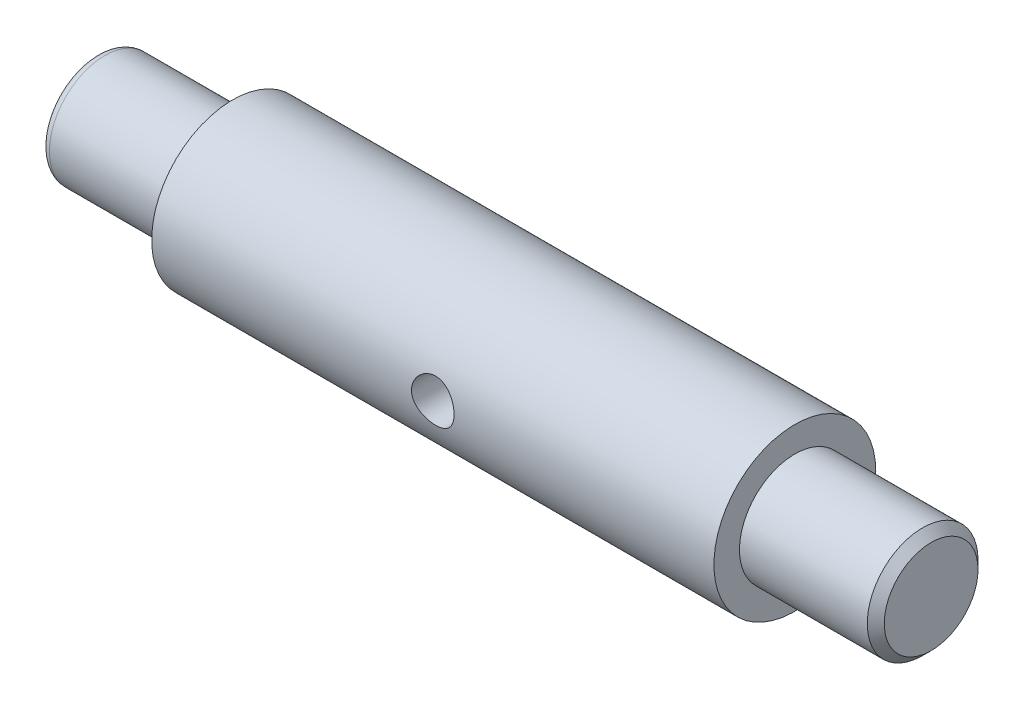
ISO-10303-21;
HEADER;
FILE_DESCRIPTION(('STEP AP214'),'2;1');
FILE_NAME('part.step','',(''),(''),'','','');
FILE_SCHEMA(('AUTOMOTIVE_DESIGN { 1 0 10303 214 1 1 1 1 }'));
ENDSEC;
DATA;
#1=APPLICATION_CONTEXT('core data for automotive mechanical design processes');
#2=APPLICATION_PROTOCOL_DEFINITION('international standard','automotive_design',2000,#1);
#3=PRODUCT_CONTEXT('',#1,'mechanical');
#4=PRODUCT('Part','Part','',(#3));
#5=PRODUCT_RELATED_PRODUCT_CATEGORY('part','',(#4));
#6=PRODUCT_DEFINITION_FORMATION('','',#4);
#7=PRODUCT_DEFINITION_CONTEXT('part definition',#1,'design');
#8=PRODUCT_DEFINITION('design','',#6,#7);
#9=PRODUCT_DEFINITION_SHAPE('','',#8);
#10=(LENGTH_UNIT() NAMED_UNIT(*) SI_UNIT(.MILLI.,.METRE.));
#11=(NAMED_UNIT(*) PLANE_ANGLE_UNIT() SI_UNIT($,.RADIAN.));
#12=(NAMED_UNIT(*) SI_UNIT($,.STERADIAN.) SOLID_ANGLE_UNIT());
#13=UNCERTAINTY_MEASURE_WITH_UNIT(LENGTH_MEASURE(1.E-05),#10,'distance_accuracy_value','');
#14=(GEOMETRIC_REPRESENTATION_CONTEXT(3) GLOBAL_UNCERTAINTY_ASSIGNED_CONTEXT((#13)) GLOBAL_UNIT_ASSIGNED_CONTEXT((#10,
#11,#12)) REPRESENTATION_CONTEXT('',''));
#15=CARTESIAN_POINT('',(0.,0.,0.));
#16=DIRECTION('',(0.,0.,1.));
#17=DIRECTION('',(1.,0.,0.));
#18=AXIS2_PLACEMENT_3D('',#15,#16,#17);
#19=CARTESIAN_POINT('',(-33.,0.,-9.5));
#20=DIRECTION('',(-1.,0.,0.));
#21=DIRECTION('',(0.,0.,1.));
#22=AXIS2_PLACEMENT_3D('',#19,#20,#21);
#23=PLANE('',#22);
#24=CARTESIAN_POINT('',(-33.,0.,0.));
#25=DIRECTION('',(1.,0.,0.));
#26=DIRECTION('',(0.,0.,-1.));
#27=AXIS2_PLACEMENT_3D('',#24,#25,#26);
#28=CIRCLE('',#27,6.5);
#29=CARTESIAN_POINT('',(-33.,0.,-6.5));
#30=VERTEX_POINT('',#29);
#31=EDGE_CURVE('E58',#30,#30,#28,.T.);
#32=ORIENTED_EDGE('',*,*,#31,.T.);
#33=EDGE_LOOP('',(#32));
#34=FACE_BOUND('',#33,.T.);
#35=CARTESIAN_POINT('',(-33.,0.,0.));
#36=DIRECTION('',(1.,0.,0.));
#37=DIRECTION('',(0.,0.,-1.));
#38=AXIS2_PLACEMENT_3D('',#35,#36,#37);
#39=CIRCLE('',#38,9.5);
#40=CARTESIAN_POINT('',(-33.,0.,-9.5));
#41=VERTEX_POINT('',#40);
#42=EDGE_CURVE('E125',#41,#41,#39,.T.);
#43=ORIENTED_EDGE('',*,*,#42,.F.);
#44=EDGE_LOOP('',(#43));
#45=FACE_BOUND('',#44,.T.);
#46=ADVANCED_FACE('F39',(#34,#45),#23,.T.);
#47=CARTESIAN_POINT('',(49.,0.,0.));
#48=DIRECTION('',(1.,0.,0.));
#49=DIRECTION('',(0.,0.,-1.));
#50=AXIS2_PLACEMENT_3D('',#47,#48,#49);
#51=CYLINDRICAL_SURFACE('',#50,6.5);
#52=CARTESIAN_POINT('',(-48.,0.,0.));
#53=DIRECTION('',(1.,0.,0.));
#54=DIRECTION('',(0.,0.,-1.));
#55=AXIS2_PLACEMENT_3D('',#52,#53,#54);
#56=CIRCLE('',#55,6.5);
#57=CARTESIAN_POINT('',(-48.,0.,-6.5));
#58=VERTEX_POINT('',#57);
#59=EDGE_CURVE('E146',#58,#58,#56,.T.);
#60=ORIENTED_EDGE('',*,*,#59,.T.);
#61=EDGE_LOOP('',(#60));
#62=FACE_BOUND('',#61,.T.);
#63=ORIENTED_EDGE('',*,*,#31,.F.);
#64=EDGE_LOOP('',(#63));
#65=FACE_BOUND('',#64,.T.);
#66=ADVANCED_FACE('F112',(#62,#65),#51,.T.);
#67=CARTESIAN_POINT('',(-48.,0.,0.));
#68=DIRECTION('',(1.,0.,0.));
#69=DIRECTION('',(0.,0.,-1.));
#70=AXIS2_PLACEMENT_3D('',#67,#68,#69);
#71=TOROIDAL_SURFACE('',#70,5.5,1.);
#72=CARTESIAN_POINT('',(-49.,0.,0.));
#73=DIRECTION('',(1.,0.,0.));
#74=DIRECTION('',(0.,0.,-1.));
#75=AXIS2_PLACEMENT_3D('',#72,#73,#74);
#76=CIRCLE('',#75,5.49999999999999);
#77=CARTESIAN_POINT('',(-49.,0.,-5.49999999999999));
#78=VERTEX_POINT('',#77);
#79=EDGE_CURVE('E143',#78,#78,#76,.T.);
#80=ORIENTED_EDGE('',*,*,#79,.T.);
#81=EDGE_LOOP('',(#80));
#82=FACE_BOUND('',#81,.T.);
#83=ORIENTED_EDGE('',*,*,#59,.F.);
#84=EDGE_LOOP('',(#83));
#85=FACE_BOUND('',#84,.T.);
#86=ADVANCED_FACE('F108',(#82,#85),#71,.T.);
#87=CARTESIAN_POINT('',(-49.,0.,-5.49999999999999));
#88=DIRECTION('',(-1.,0.,0.));
#89=DIRECTION('',(0.,0.,1.));
#90=AXIS2_PLACEMENT_3D('',#87,#88,#89);
#91=PLANE('',#90);
#92=CARTESIAN_POINT('',(-49.,0.,0.));
#93=DIRECTION('',(1.,0.,0.));
#94=DIRECTION('',(0.,0.,-1.));
#95=AXIS2_PLACEMENT_3D('',#92,#93,#94);
#96=CIRCLE('',#95,3.625);
#97=CARTESIAN_POINT('',(-49.,0.,-3.625));
#98=VERTEX_POINT('',#97);
#99=EDGE_CURVE('E140',#98,#98,#96,.T.);
#100=ORIENTED_EDGE('',*,*,#99,.T.);
#101=EDGE_LOOP('',(#100));
#102=FACE_BOUND('',#101,.T.);
#103=ORIENTED_EDGE('',*,*,#79,.F.);
#104=EDGE_LOOP('',(#103));
#105=FACE_BOUND('',#104,.T.);
#106=ADVANCED_FACE('F104',(#102,#105),#91,.T.);
#107=CARTESIAN_POINT('',(-48.375,0.,0.));
#108=DIRECTION('',(1.,0.,0.));
#109=DIRECTION('',(0.,0.,-1.));
#110=AXIS2_PLACEMENT_3D('',#107,#108,#109);
#111=TOROIDAL_SURFACE('',#110,3.625,0.625);
#112=CARTESIAN_POINT('',(-48.375,0.,0.));
#113=DIRECTION('',(1.,0.,0.));
#114=DIRECTION('',(0.,0.,-1.));
#115=AXIS2_PLACEMENT_3D('',#112,#113,#114);
#116=CIRCLE('',#115,3.);
#117=CARTESIAN_POINT('',(-48.375,0.,-3.));
#118=VERTEX_POINT('',#117);
#119=EDGE_CURVE('E137',#118,#118,#116,.T.);
#120=ORIENTED_EDGE('',*,*,#119,.T.);
#121=EDGE_LOOP('',(#120));
#122=FACE_BOUND('',#121,.T.);
#123=ORIENTED_EDGE('',*,*,#99,.F.);
#124=EDGE_LOOP('',(#123));
#125=FACE_BOUND('',#124,.T.);
#126=ADVANCED_FACE('F98',(#122,#125),#111,.T.);
#127=CARTESIAN_POINT('',(49.,0.,0.));
#128=DIRECTION('',(1.,0.,0.));
#129=DIRECTION('',(0.,0.,-1.));
#130=AXIS2_PLACEMENT_3D('',#127,#128,#129);
#131=CYLINDRICAL_SURFACE('',#130,3.);
#132=CARTESIAN_POINT('',(-2.5,0.,-3.));
#133=CARTESIAN_POINT('',(-2.49999511444632,-0.118757533193203,-2.99999522795205));
#134=CARTESIAN_POINT('',(-2.49147749609542,-0.237551281104128,-2.99288670594742));
#135=CARTESIAN_POINT('',(-2.45803727664817,-0.471182492492811,-2.96510762868268));
#136=CARTESIAN_POINT('',(-2.43310252602469,-0.586016959612417,-2.94442702942008));
#137=CARTESIAN_POINT('',(-2.36868788266729,-0.807829942407297,-2.89142690238865));
#138=CARTESIAN_POINT('',(-2.32929492564629,-0.914850920904901,-2.8591769655007));
#139=CARTESIAN_POINT('',(-2.23798295205742,-1.11984139043408,-2.78529176182903));
#140=CARTESIAN_POINT('',(-2.18605970332675,-1.21780780775233,-2.74365332434937));
#141=CARTESIAN_POINT('',(-2.05054625019185,-1.43789998519767,-2.63674191529867));
#142=CARTESIAN_POINT('',(-1.96232979581782,-1.5556821965722,-2.56840549256191));
#143=CARTESIAN_POINT('',(-1.76947567424863,-1.77202398328147,-2.42422624777674));
#144=CARTESIAN_POINT('',(-1.66479243075689,-1.87052845158605,-2.34836281453276));
#145=CARTESIAN_POINT('',(-1.49591572350891,-2.00437263805588,-2.23294886313738));
#146=CARTESIAN_POINT('',(-1.4370444238087,-2.04699726278816,-2.19383679994997));
#147=CARTESIAN_POINT('',(-1.3154943970395,-2.12715295529554,-2.11620611809194));
#148=CARTESIAN_POINT('',(-1.25281440512926,-2.16468231743739,-2.07768770195023));
#149=CARTESIAN_POINT('',(-1.12373267566439,-2.23441122570746,-2.00250543288661));
#150=CARTESIAN_POINT('',(-1.05734021527518,-2.26662332666226,-1.96583735754651));
#151=CARTESIAN_POINT('',(-0.92055371607161,-2.32553690612792,-1.89577686630311));
#152=CARTESIAN_POINT('',(-0.850163152658207,-2.3522430799868,-1.86238167220904));
#153=CARTESIAN_POINT('',(-0.698332909799902,-2.40193513934005,-1.79791918980412));
#154=CARTESIAN_POINT('',(-0.616475907276521,-2.42433807692598,-1.76736311251003));
#155=CARTESIAN_POINT('',(-0.4481102311869,-2.46101313675502,-1.71593180556004));
#156=CARTESIAN_POINT('',(-0.361613413385329,-2.47530499393792,-1.69503310194197));
#157=CARTESIAN_POINT('',(-0.184234591620548,-2.49481072799048,-1.66620928968844));
#158=CARTESIAN_POINT('',(-0.0933120409293111,-2.49991205058667,-1.65844510563093));
#159=CARTESIAN_POINT('',(0.088562613002758,-2.5000856937119,-1.65818308531825));
#160=CARTESIAN_POINT('',(0.179514716615331,-2.49515788278405,-1.6656854491694));
#161=CARTESIAN_POINT('',(0.365524710827116,-2.47505262029594,-1.69541639464497));
#162=CARTESIAN_POINT('',(0.46029374571706,-2.45905577113332,-1.71881932066467));
#163=CARTESIAN_POINT('',(0.644210981202169,-2.41742550503027,-1.77688235738914));
#164=CARTESIAN_POINT('',(0.733339370714817,-2.39176011044289,-1.81157977103025));
#165=CARTESIAN_POINT('',(0.887827078541098,-2.33816270346873,-1.88002226126137));
#166=CARTESIAN_POINT('',(0.954312242411647,-2.31177513033566,-1.91250316845439));
#167=CARTESIAN_POINT('',(1.08365080677993,-2.25404424958636,-1.98021996661529));
#168=CARTESIAN_POINT('',(1.14650204786583,-2.22269803586306,-2.01545746697785));
#169=CARTESIAN_POINT('',(1.32996684101967,-2.12149677560466,-2.12342648109725));
#170=CARTESIAN_POINT('',(1.44541414760608,-2.04450664231777,-2.19837696967438));
#171=CARTESIAN_POINT('',(1.66826696245435,-1.86765914501414,-2.35079897952278));
#172=CARTESIAN_POINT('',(1.77493832399189,-1.76681805277628,-2.42819792618944));
#173=CARTESIAN_POINT('',(1.9711123448174,-1.54484388336149,-2.57509054043285));
#174=CARTESIAN_POINT('',(2.06065203305626,-1.42375565615773,-2.64460112267364));
#175=CARTESIAN_POINT('',(2.19941483909855,-1.19411179169416,-2.75428914126547));
#176=CARTESIAN_POINT('',(2.25314289818765,-1.08972732107277,-2.79748350073995));
#177=CARTESIAN_POINT('',(2.34634274525534,-0.871071458330367,-2.87307804019801));
#178=CARTESIAN_POINT('',(2.38582343158057,-0.756806292780763,-2.90548495660805));
#179=CARTESIAN_POINT('',(2.4484172499322,-0.519954301215418,-2.95709834265565));
#180=CARTESIAN_POINT('',(2.47140394665756,-0.397310923125307,-2.97620280955844));
#181=CARTESIAN_POINT('',(2.49870923192719,-0.148559976923726,-2.99891434528972));
#182=CARTESIAN_POINT('',(2.50304031085016,-0.0224547835240011,-3.00253178304177));
#183=CARTESIAN_POINT('',(2.49333756055624,0.213310199456575,-2.99444999039147));
#184=CARTESIAN_POINT('',(2.48144136128483,0.323130540835859,-2.98453350716313));
#185=CARTESIAN_POINT('',(2.44373304978851,0.538644964400605,-2.95325589460135));
#186=CARTESIAN_POINT('',(2.41791926828104,0.644338549989562,-2.93189339242796));
#187=CARTESIAN_POINT('',(2.35337660454474,0.850565499199257,-2.87889521546186));
#188=CARTESIAN_POINT('',(2.31447921055573,0.951010682223317,-2.84712564891974));
#189=CARTESIAN_POINT('',(2.2256043676633,1.14365900898104,-2.77536124733889));
#190=CARTESIAN_POINT('',(2.17562282300671,1.2358590883121,-2.73536337221808));
#191=CARTESIAN_POINT('',(2.04156820465303,1.45067439735099,-2.62975152158594));
#192=CARTESIAN_POINT('',(1.9522674167327,1.56834359540731,-2.56070244234714));
#193=CARTESIAN_POINT('',(1.75715961734437,1.78428994740848,-2.41522445403191));
#194=CARTESIAN_POINT('',(1.65130154464525,1.88250490855173,-2.33877300422835));
#195=CARTESIAN_POINT('',(1.48058803207138,2.01573314784291,-2.222698055986));
#196=CARTESIAN_POINT('',(1.42110172702401,2.05811069143949,-2.1834115173603));
#197=CARTESIAN_POINT('',(1.29827918396772,2.13771669597406,-2.10553153817181));
#198=CARTESIAN_POINT('',(1.2349415723359,2.17494330406755,-2.06693835133607));
#199=CARTESIAN_POINT('',(1.10451159608481,2.24398857026757,-1.99176108482639));
#200=CARTESIAN_POINT('',(1.03742977546639,2.27582148781538,-1.95517188634212));
#201=CARTESIAN_POINT('',(0.899209895500169,2.3338885673946,-1.88547561448179));
#202=CARTESIAN_POINT('',(0.828075629580628,2.36012785984655,-1.8523653645079));
#203=CARTESIAN_POINT('',(0.675729631648113,2.40837357148322,-1.78925557416047));
#204=CARTESIAN_POINT('',(0.594165548926274,2.42988314318544,-1.75970711786653));
#205=CARTESIAN_POINT('',(0.426548046057394,2.46482255689514,-1.71043063887427));
#206=CARTESIAN_POINT('',(0.340506428672119,2.47827257713357,-1.69067811225259));
#207=CARTESIAN_POINT('',(0.164362392587668,2.49617289535263,-1.6641531597946));
#208=CARTESIAN_POINT('',(0.0742246702493123,2.5005179918396,-1.65753251048391));
#209=CARTESIAN_POINT('',(-0.105853212783939,2.49938197104455,-1.65924308630667));
#210=CARTESIAN_POINT('',(-0.195793315125139,2.49389826274012,-1.66757825402155));
#211=CARTESIAN_POINT('',(-0.381672575390523,2.4726526384854,-1.69892898735519));
#212=CARTESIAN_POINT('',(-0.47723027053268,2.45585812550761,-1.72341371023858));
#213=CARTESIAN_POINT('',(-0.662531296082708,2.41250339675091,-1.78358728037387));
#214=CARTESIAN_POINT('',(-0.752254228709298,2.38591088285909,-1.81931312531326));
#215=CARTESIAN_POINT('',(-0.907789041354843,2.33050835844919,-1.88952619366194));
#216=CARTESIAN_POINT('',(-0.974743759234924,2.30325853049531,-1.92277816627791));
#217=CARTESIAN_POINT('',(-1.1049463864244,2.24370627018012,-1.99195185230571));
#218=CARTESIAN_POINT('',(-1.16819211099982,2.21140090020864,-2.0278751115052));
#219=CARTESIAN_POINT('',(-1.35272956134196,2.10716294428985,-2.13775931167912));
#220=CARTESIAN_POINT('',(-1.46874692499193,2.02793576743751,-2.2137978016432));
#221=CARTESIAN_POINT('',(-1.69200726129125,1.84629697567414,-2.36772603763546));
#222=CARTESIAN_POINT('',(-1.79854179403293,1.7429395959328,-2.44552394429512));
#223=CARTESIAN_POINT('',(-1.99386379953934,1.51553554935621,-2.59256498427755));
#224=CARTESIAN_POINT('',(-2.08269056587395,1.39153583663215,-2.66182692543068));
#225=CARTESIAN_POINT('',(-2.21831419672309,1.15855518141083,-2.76942305781508));
#226=CARTESIAN_POINT('',(-2.27003851021944,1.05399877947693,-2.81112174006883));
#227=CARTESIAN_POINT('',(-2.35921867023858,0.835439786054357,-2.88361460666453));
#228=CARTESIAN_POINT('',(-2.39669352409529,0.721450026753903,-2.9144233132377));
#229=CARTESIAN_POINT('',(-2.45018845582659,0.506620038886857,-2.95858745904691));
#230=CARTESIAN_POINT('',(-2.46877512222678,0.406845468761923,-2.97402142398111));
#231=CARTESIAN_POINT('',(-2.49368236823808,0.204722725654237,-2.99472922794408));
#232=CARTESIAN_POINT('',(-2.50000421158692,0.102374818922784,-3.00000411373941));
#233=CARTESIAN_POINT('',(-2.5,0.,-3.));
#234=B_SPLINE_CURVE_WITH_KNOTS('',3,(#132,#133,#134,#135,#136,#137,#138,#139,#140,#141,#142,
#143,#144,#145,#146,#147,#148,#149,#150,#151,#152,#153,#154,#155,#156,#157,#158,#159,#160,#161,
#162,#163,#164,#165,#166,#167,#168,#169,#170,#171,#172,#173,#174,#175,#176,#177,#178,#179,#180,
#181,#182,#183,#184,#185,#186,#187,#188,#189,#190,#191,#192,#193,#194,#195,#196,#197,#198,#199,
#200,#201,#202,#203,#204,#205,#206,#207,#208,#209,#210,#211,#212,#213,#214,#215,#216,#217,#218,
#219,#220,#221,#222,#223,#224,#225,#226,#227,#228,#229,#230,#231,#232,#233),.UNSPECIFIED.,.T.,
.F.,(4,2,2,2,2,2,2,2,2,2,2,2,2,2,2,2,2,2,2,2,2,2,2,2,2,2,2,2,2,2,2,2,2,2,2,2,2,2,2,2,2,2,2,2,2,
2,2,2,2,2,4),(0.,0.355841276815113,0.711946191026961,1.06594405359551,1.42006164830116,
1.90425178760126,2.38980643116775,2.63722280423449,2.88472179650724,3.13162777943676,
3.37832232674674,3.64812890035755,3.91727616616869,4.18969776924975,4.46212294312047,
4.75723524199722,5.05333228584568,5.28870178855694,5.52420974868633,5.9954933935898,
6.49137310548271,6.98616858956867,7.36002155957576,7.73364063000476,8.11009395319721,
8.48629519274361,8.81743460677926,9.14861374669872,9.48423297747607,9.81997643164434,
10.3065635514456,10.7946819775667,11.0432812121088,11.2919696391639,11.5399899810636,
11.787781852862,12.0551105531685,12.3217671309317,12.5914881373799,12.8612802568452,
13.1598101383752,13.4593330283462,13.6977271411687,13.9362602949129,14.4135864576438,
14.914300110886,15.413889999571,15.7841228897598,16.1538601797496,16.4606444271243,
16.7673970625124),.UNSPECIFIED.);
#235=CARTESIAN_POINT('',(-2.5,0.,-3.));
#236=VERTEX_POINT('',#235);
#237=EDGE_CURVE('E87',#236,#236,#234,.T.);
#238=ORIENTED_EDGE('',*,*,#237,.F.);
#239=EDGE_LOOP('',(#238));
#240=FACE_BOUND('',#239,.T.);
#241=CARTESIAN_POINT('',(2.5,0.,3.));
#242=CARTESIAN_POINT('',(2.49999511444632,-0.118757533193203,2.99999522795205));
#243=CARTESIAN_POINT('',(2.49147749609542,-0.237551281104128,2.99288670594742));
#244=CARTESIAN_POINT('',(2.45803727664817,-0.471182492492811,2.96510762868268));
#245=CARTESIAN_POINT('',(2.43310252602469,-0.586016959612417,2.94442702942007));
#246=CARTESIAN_POINT('',(2.36868788266729,-0.807829942407297,2.89142690238865));
#247=CARTESIAN_POINT('',(2.32929492564629,-0.914850920904901,2.8591769655007));
#248=CARTESIAN_POINT('',(2.23798295205742,-1.11984139043408,2.78529176182902));
#249=CARTESIAN_POINT('',(2.18605970332675,-1.21780780775233,2.74365332434936));
#250=CARTESIAN_POINT('',(2.05054625019184,-1.43789998519767,2.63674191529867));
#251=CARTESIAN_POINT('',(1.96232979581782,-1.5556821965722,2.56840549256191));
#252=CARTESIAN_POINT('',(1.76947567424863,-1.77202398328147,2.42422624777674));
#253=CARTESIAN_POINT('',(1.66479243075689,-1.87052845158605,2.34836281453276));
#254=CARTESIAN_POINT('',(1.49591572350891,-2.00437263805588,2.23294886313738));
#255=CARTESIAN_POINT('',(1.4370444238087,-2.04699726278816,2.19383679994997));
#256=CARTESIAN_POINT('',(1.3154943970395,-2.12715295529554,2.11620611809193));
#257=CARTESIAN_POINT('',(1.25281440512926,-2.16468231743739,2.07768770195023));
#258=CARTESIAN_POINT('',(1.12373267566439,-2.23441122570746,2.00250543288661));
#259=CARTESIAN_POINT('',(1.05734021527518,-2.26662332666227,1.96583735754651));
#260=CARTESIAN_POINT('',(0.920553716071609,-2.32553690612792,1.89577686630311));
#261=CARTESIAN_POINT('',(0.850163152658207,-2.3522430799868,1.86238167220904));
#262=CARTESIAN_POINT('',(0.698332909799902,-2.40193513934005,1.79791918980412));
#263=CARTESIAN_POINT('',(0.61647590727652,-2.42433807692598,1.76736311251003));
#264=CARTESIAN_POINT('',(0.448110231186899,-2.46101313675502,1.71593180556003));
#265=CARTESIAN_POINT('',(0.361613413385328,-2.47530499393792,1.69503310194197));
#266=CARTESIAN_POINT('',(0.184234591620548,-2.49481072799048,1.66620928968844));
#267=CARTESIAN_POINT('',(0.0933120409293107,-2.49991205058667,1.65844510563093));
#268=CARTESIAN_POINT('',(-0.0885626130027583,-2.5000856937119,1.65818308531825));
#269=CARTESIAN_POINT('',(-0.179514716615332,-2.49515788278405,1.6656854491694));
#270=CARTESIAN_POINT('',(-0.365524710827117,-2.47505262029594,1.69541639464497));
#271=CARTESIAN_POINT('',(-0.46029374571706,-2.45905577113332,1.71881932066467));
#272=CARTESIAN_POINT('',(-0.64421098120217,-2.41742550503027,1.77688235738913));
#273=CARTESIAN_POINT('',(-0.733339370714817,-2.39176011044289,1.81157977103024));
#274=CARTESIAN_POINT('',(-0.887827078541099,-2.33816270346873,1.88002226126137));
#275=CARTESIAN_POINT('',(-0.954312242411648,-2.31177513033566,1.91250316845439));
#276=CARTESIAN_POINT('',(-1.08365080677993,-2.25404424958636,1.98021996661529));
#277=CARTESIAN_POINT('',(-1.14650204786584,-2.22269803586306,2.01545746697785));
#278=CARTESIAN_POINT('',(-1.32996684101967,-2.12149677560466,2.12342648109724));
#279=CARTESIAN_POINT('',(-1.44541414760608,-2.04450664231777,2.19837696967438));
#280=CARTESIAN_POINT('',(-1.66826696245435,-1.86765914501414,2.35079897952277));
#281=CARTESIAN_POINT('',(-1.77493832399189,-1.76681805277628,2.42819792618944));
#282=CARTESIAN_POINT('',(-1.9711123448174,-1.54484388336149,2.57509054043285));
#283=CARTESIAN_POINT('',(-2.06065203305626,-1.42375565615773,2.64460112267364));
#284=CARTESIAN_POINT('',(-2.19941483909855,-1.19411179169416,2.75428914126547));
#285=CARTESIAN_POINT('',(-2.25314289818765,-1.08972732107277,2.79748350073995));
#286=CARTESIAN_POINT('',(-2.34634274525534,-0.871071458330366,2.87307804019801));
#287=CARTESIAN_POINT('',(-2.38582343158057,-0.756806292780763,2.90548495660805));
#288=CARTESIAN_POINT('',(-2.4484172499322,-0.519954301215418,2.95709834265565));
#289=CARTESIAN_POINT('',(-2.47140394665756,-0.397310923125308,2.97620280955844));
#290=CARTESIAN_POINT('',(-2.49870923192719,-0.148559976923726,2.99891434528972));
#291=CARTESIAN_POINT('',(-2.50304031085016,-0.0224547835240012,3.00253178304177));
#292=CARTESIAN_POINT('',(-2.49333756055624,0.213310199456575,2.99444999039147));
#293=CARTESIAN_POINT('',(-2.48144136128483,0.323130540835859,2.98453350716313));
#294=CARTESIAN_POINT('',(-2.44373304978851,0.538644964400605,2.95325589460135));
#295=CARTESIAN_POINT('',(-2.41791926828104,0.644338549989562,2.93189339242796));
#296=CARTESIAN_POINT('',(-2.35337660454474,0.850565499199257,2.87889521546186));
#297=CARTESIAN_POINT('',(-2.31447921055573,0.951010682223317,2.84712564891974));
#298=CARTESIAN_POINT('',(-2.2256043676633,1.14365900898104,2.77536124733889));
#299=CARTESIAN_POINT('',(-2.17562282300671,1.2358590883121,2.73536337221808));
#300=CARTESIAN_POINT('',(-2.04156820465303,1.45067439735099,2.62975152158594));
#301=CARTESIAN_POINT('',(-1.9522674167327,1.56834359540731,2.56070244234714));
#302=CARTESIAN_POINT('',(-1.75715961734437,1.78428994740848,2.41522445403191));
#303=CARTESIAN_POINT('',(-1.65130154464525,1.88250490855173,2.33877300422835));
#304=CARTESIAN_POINT('',(-1.48058803207139,2.01573314784291,2.222698055986));
#305=CARTESIAN_POINT('',(-1.42110172702401,2.05811069143949,2.1834115173603));
#306=CARTESIAN_POINT('',(-1.29827918396772,2.13771669597406,2.10553153817181));
#307=CARTESIAN_POINT('',(-1.2349415723359,2.17494330406755,2.06693835133607));
#308=CARTESIAN_POINT('',(-1.10451159608481,2.24398857026757,1.99176108482639));
#309=CARTESIAN_POINT('',(-1.03742977546639,2.27582148781538,1.95517188634212));
#310=CARTESIAN_POINT('',(-0.899209895500171,2.3338885673946,1.88547561448179));
#311=CARTESIAN_POINT('',(-0.82807562958063,2.36012785984655,1.8523653645079));
#312=CARTESIAN_POINT('',(-0.675729631648114,2.40837357148322,1.78925557416047));
#313=CARTESIAN_POINT('',(-0.594165548926275,2.42988314318544,1.75970711786653));
#314=CARTESIAN_POINT('',(-0.426548046057395,2.46482255689514,1.71043063887427));
#315=CARTESIAN_POINT('',(-0.34050642867212,2.47827257713357,1.69067811225259));
#316=CARTESIAN_POINT('',(-0.164362392587669,2.49617289535263,1.6641531597946));
#317=CARTESIAN_POINT('',(-0.0742246702493137,2.5005179918396,1.65753251048391));
#318=CARTESIAN_POINT('',(0.105853212783938,2.49938197104455,1.65924308630667));
#319=CARTESIAN_POINT('',(0.195793315125138,2.49389826274012,1.66757825402155));
#320=CARTESIAN_POINT('',(0.381672575390523,2.4726526384854,1.69892898735519));
#321=CARTESIAN_POINT('',(0.47723027053268,2.45585812550761,1.72341371023858));
#322=CARTESIAN_POINT('',(0.662531296082708,2.41250339675091,1.78358728037387));
#323=CARTESIAN_POINT('',(0.752254228709298,2.38591088285909,1.81931312531326));
#324=CARTESIAN_POINT('',(0.907789041354843,2.33050835844919,1.88952619366194));
#325=CARTESIAN_POINT('',(0.974743759234924,2.30325853049531,1.92277816627791));
#326=CARTESIAN_POINT('',(1.1049463864244,2.24370627018012,1.9919518523057));
#327=CARTESIAN_POINT('',(1.16819211099982,2.21140090020864,2.0278751115052));
#328=CARTESIAN_POINT('',(1.35272956134196,2.10716294428985,2.13775931167912));
#329=CARTESIAN_POINT('',(1.46874692499194,2.02793576743751,2.2137978016432));
#330=CARTESIAN_POINT('',(1.69200726129125,1.84629697567414,2.36772603763546));
#331=CARTESIAN_POINT('',(1.79854179403292,1.7429395959328,2.44552394429512));
#332=CARTESIAN_POINT('',(1.99386379953934,1.51553554935621,2.59256498427754));
#333=CARTESIAN_POINT('',(2.08269056587395,1.39153583663215,2.66182692543068));
#334=CARTESIAN_POINT('',(2.21831419672309,1.15855518141083,2.76942305781508));
#335=CARTESIAN_POINT('',(2.27003851021944,1.05399877947693,2.81112174006882));
#336=CARTESIAN_POINT('',(2.35921867023858,0.835439786054358,2.88361460666452));
#337=CARTESIAN_POINT('',(2.39669352409529,0.721450026753904,2.9144233132377));
#338=CARTESIAN_POINT('',(2.45018845582659,0.506620038886858,2.9585874590469));
#339=CARTESIAN_POINT('',(2.46877512222678,0.406845468761923,2.97402142398111));
#340=CARTESIAN_POINT('',(2.49368236823808,0.204722725654237,2.99472922794408));
#341=CARTESIAN_POINT('',(2.50000421158692,0.102374818922784,3.00000411373941));
#342=CARTESIAN_POINT('',(2.5,0.,3.));
#343=B_SPLINE_CURVE_WITH_KNOTS('',3,(#241,#242,#243,#244,#245,#246,#247,#248,#249,#250,#251,
#252,#253,#254,#255,#256,#257,#258,#259,#260,#261,#262,#263,#264,#265,#266,#267,#268,#269,#270,
#271,#272,#273,#274,#275,#276,#277,#278,#279,#280,#281,#282,#283,#284,#285,#286,#287,#288,#289,
#290,#291,#292,#293,#294,#295,#296,#297,#298,#299,#300,#301,#302,#303,#304,#305,#306,#307,#308,
#309,#310,#311,#312,#313,#314,#315,#316,#317,#318,#319,#320,#321,#322,#323,#324,#325,#326,#327,
#328,#329,#330,#331,#332,#333,#334,#335,#336,#337,#338,#339,#340,#341,#342),.UNSPECIFIED.,.T.,
.F.,(4,2,2,2,2,2,2,2,2,2,2,2,2,2,2,2,2,2,2,2,2,2,2,2,2,2,2,2,2,2,2,2,2,2,2,2,2,2,2,2,2,2,2,2,2,
2,2,2,2,2,4),(0.,0.355841276815113,0.711946191026961,1.06594405359551,1.42006164830116,
1.90425178760126,2.38980643116775,2.63722280423449,2.88472179650724,3.13162777943676,
3.37832232674674,3.64812890035755,3.91727616616869,4.18969776924975,4.46212294312047,
4.75723524199722,5.05333228584568,5.28870178855694,5.52420974868633,5.9954933935898,
6.49137310548271,6.98616858956867,7.36002155957576,7.73364063000476,8.11009395319721,
8.48629519274361,8.81743460677927,9.14861374669872,9.48423297747607,9.81997643164434,
10.3065635514456,10.7946819775667,11.0432812121088,11.2919696391639,11.5399899810636,
11.787781852862,12.0551105531685,12.3217671309317,12.5914881373799,12.8612802568452,
13.1598101383752,13.4593330283462,13.6977271411687,13.9362602949129,14.4135864576438,
14.914300110886,15.413889999571,15.7841228897598,16.1538601797496,16.4606444271243,
16.7673970625124),.UNSPECIFIED.);
#344=CARTESIAN_POINT('',(2.5,0.,3.));
#345=VERTEX_POINT('',#344);
#346=EDGE_CURVE('E81',#345,#345,#343,.T.);
#347=ORIENTED_EDGE('',*,*,#346,.F.);
#348=EDGE_LOOP('',(#347));
#349=FACE_BOUND('',#348,.T.);
#350=ORIENTED_EDGE('',*,*,#119,.F.);
#351=EDGE_LOOP('',(#350));
#352=FACE_BOUND('',#351,.T.);
#353=CARTESIAN_POINT('',(12.,0.,0.));
#354=DIRECTION('',(-1.,0.,0.));
#355=DIRECTION('',(0.,0.,1.));
#356=AXIS2_PLACEMENT_3D('',#353,#354,#355);
#357=CIRCLE('',#356,3.);
#358=CARTESIAN_POINT('',(12.,0.,3.));
#359=VERTEX_POINT('',#358);
#360=EDGE_CURVE('E128',#359,#359,#357,.T.);
#361=ORIENTED_EDGE('',*,*,#360,.F.);
#362=EDGE_LOOP('',(#361));
#363=FACE_BOUND('',#362,.T.);
#364=ADVANCED_FACE('F92',(#240,#349,#352,#363),#131,.F.);
#365=CARTESIAN_POINT('',(49.,0.,-6.5));
#366=DIRECTION('',(1.,0.,0.));
#367=DIRECTION('',(0.,0.,-1.));
#368=AXIS2_PLACEMENT_3D('',#365,#366,#367);
#369=PLANE('',#368);
#370=CARTESIAN_POINT('',(49.,0.,0.));
#371=DIRECTION('',(1.,0.,0.));
#372=DIRECTION('',(0.,0.,-1.));
#373=AXIS2_PLACEMENT_3D('',#370,#371,#372);
#374=CIRCLE('',#373,5.49999999999999);
#375=CARTESIAN_POINT('',(49.,0.,-5.49999999999999));
#376=VERTEX_POINT('',#375);
#377=EDGE_CURVE('E53',#376,#376,#374,.T.);
#378=ORIENTED_EDGE('',*,*,#377,.T.);
#379=EDGE_LOOP('',(#378));
#380=FACE_BOUND('',#379,.T.);
#381=ADVANCED_FACE('F97',(#380),#369,.T.);
#382=CARTESIAN_POINT('',(49.,0.,0.));
#383=DIRECTION('',(1.,0.,0.));
#384=DIRECTION('',(0.,0.,-1.));
#385=AXIS2_PLACEMENT_3D('',#382,#383,#384);
#386=CYLINDRICAL_SURFACE('',#385,6.49999999999999);
#387=CARTESIAN_POINT('',(48.,0.,0.));
#388=DIRECTION('',(1.,0.,0.));
#389=DIRECTION('',(0.,0.,-1.));
#390=AXIS2_PLACEMENT_3D('',#387,#388,#389);
#391=CIRCLE('',#390,6.49999999999999);
#392=CARTESIAN_POINT('',(48.,0.,-6.5));
#393=VERTEX_POINT('',#392);
#394=EDGE_CURVE('E10',#393,#393,#391,.F.);
#395=ORIENTED_EDGE('',*,*,#394,.T.);
#396=EDGE_LOOP('',(#395));
#397=FACE_BOUND('',#396,.T.);
#398=CARTESIAN_POINT('',(33.,0.,0.));
#399=DIRECTION('',(1.,0.,0.));
#400=DIRECTION('',(0.,0.,-1.));
#401=AXIS2_PLACEMENT_3D('',#398,#399,#400);
#402=CIRCLE('',#401,6.49999999999999);
#403=CARTESIAN_POINT('',(33.,0.,-6.49999999999999));
#404=VERTEX_POINT('',#403);
#405=EDGE_CURVE('E131',#404,#404,#402,.T.);
#406=ORIENTED_EDGE('',*,*,#405,.T.);
#407=EDGE_LOOP('',(#406));
#408=FACE_BOUND('',#407,.T.);
#409=ADVANCED_FACE('F175',(#397,#408),#386,.T.);
#410=CARTESIAN_POINT('',(33.,0.,-9.5));
#411=DIRECTION('',(1.,0.,0.));
#412=DIRECTION('',(0.,0.,-1.));
#413=AXIS2_PLACEMENT_3D('',#410,#411,#412);
#414=PLANE('',#413);
#415=CARTESIAN_POINT('',(33.,0.,0.));
#416=DIRECTION('',(1.,0.,0.));
#417=DIRECTION('',(0.,0.,-1.));
#418=AXIS2_PLACEMENT_3D('',#415,#416,#417);
#419=CIRCLE('',#418,9.5);
#420=CARTESIAN_POINT('',(33.,0.,-9.5));
#421=VERTEX_POINT('',#420);
#422=EDGE_CURVE('E127',#421,#421,#419,.T.);
#423=ORIENTED_EDGE('',*,*,#422,.T.);
#424=EDGE_LOOP('',(#423));
#425=FACE_BOUND('',#424,.T.);
#426=ORIENTED_EDGE('',*,*,#405,.F.);
#427=EDGE_LOOP('',(#426));
#428=FACE_BOUND('',#427,.T.);
#429=ADVANCED_FACE('F169',(#425,#428),#414,.T.);
#430=CARTESIAN_POINT('',(49.,0.,0.));
#431=DIRECTION('',(1.,0.,0.));
#432=DIRECTION('',(0.,0.,-1.));
#433=AXIS2_PLACEMENT_3D('',#430,#431,#432);
#434=CYLINDRICAL_SURFACE('',#433,9.5);
#435=CARTESIAN_POINT('',(-2.5,0.,-9.5));
#436=CARTESIAN_POINT('',(-2.49999659165872,0.137884663200167,-9.4999978589319));
#437=CARTESIAN_POINT('',(-2.48855441851344,0.275806169982054,-9.49696845553717));
#438=CARTESIAN_POINT('',(-2.44316636127436,0.547680422104071,-9.48517762614523));
#439=CARTESIAN_POINT('',(-2.40920923415978,0.681631149673865,-9.47641333641575));
#440=CARTESIAN_POINT('',(-2.31996842460177,0.941599795218326,-9.45412076326044));
#441=CARTESIAN_POINT('',(-2.26471183560934,1.06762755548515,-9.44059853395071));
#442=CARTESIAN_POINT('',(-2.13453997893622,1.30862652881559,-9.41022151532826));
#443=CARTESIAN_POINT('',(-2.05962353819611,1.42359708156079,-9.39336652717205));
#444=CARTESIAN_POINT('',(-1.89046838430234,1.64181993629425,-9.35771941636593));
#445=CARTESIAN_POINT('',(-1.79586767243448,1.74478634632153,-9.33889486727958));
#446=CARTESIAN_POINT('',(-1.59080344133392,1.93359084586557,-9.30164002957558));
#447=CARTESIAN_POINT('',(-1.48033793898573,2.01942679084604,-9.28320979057852));
#448=CARTESIAN_POINT('',(-1.24441123162361,2.17291708512181,-9.24849966110085));
#449=CARTESIAN_POINT('',(-1.11873074770614,2.24024449868173,-9.23226073792112));
#450=CARTESIAN_POINT('',(-0.857337895776609,2.35270147526438,-9.20424780640168));
#451=CARTESIAN_POINT('',(-0.721627328959783,2.39783501276008,-9.19247299871599));
#452=CARTESIAN_POINT('',(-0.447188071893532,2.46363395134783,-9.17505594709916));
#453=CARTESIAN_POINT('',(-0.308591852154177,2.48481677617339,-9.16928424369479));
#454=CARTESIAN_POINT('',(-0.029701994327015,2.50372582423423,-9.16413995150101));
#455=CARTESIAN_POINT('',(0.110591330921411,2.50145630672462,-9.16476620075867));
#456=CARTESIAN_POINT('',(0.384870229447289,2.47393631594875,-9.1722310773399));
#457=CARTESIAN_POINT('',(0.518923733737234,2.44930986906015,-9.1789010040012));
#458=CARTESIAN_POINT('',(0.780926003675862,2.37877367007175,-9.19743185586801));
#459=CARTESIAN_POINT('',(0.908874291939745,2.33286225663581,-9.2092931862694));
#460=CARTESIAN_POINT('',(1.15667078708533,2.22054589835919,-9.23702010881477));
#461=CARTESIAN_POINT('',(1.27641410406569,2.1539205316978,-9.25292841794965));
#462=CARTESIAN_POINT('',(1.50324135914492,2.00222137020021,-9.28693362281546));
#463=CARTESIAN_POINT('',(1.61032285819791,1.91714402987704,-9.30503093886097));
#464=CARTESIAN_POINT('',(1.81235449245534,1.72775627146103,-9.3420790135668));
#465=CARTESIAN_POINT('',(1.90681192197981,1.62292126601543,-9.36103863220119));
#466=CARTESIAN_POINT('',(2.07690465439776,1.3986680904507,-9.39715951587145));
#467=CARTESIAN_POINT('',(2.15253925337258,1.27924937519245,-9.41432071363776));
#468=CARTESIAN_POINT('',(2.28304842996164,1.02846858783735,-9.44501219877018));
#469=CARTESIAN_POINT('',(2.33783581683645,0.89705914371785,-9.45852716922197));
#470=CARTESIAN_POINT('',(2.42440041379598,0.626458525351713,-9.48029259145042));
#471=CARTESIAN_POINT('',(2.45618251631392,0.487269012444906,-9.48854416252685));
#472=CARTESIAN_POINT('',(2.4950653206345,0.209265832527546,-9.49868456798611));
#473=CARTESIAN_POINT('',(2.50283612700282,0.0705520479839304,-9.50074610556025));
#474=CARTESIAN_POINT('',(2.49532360387433,-0.206196087317413,-9.49876969604928));
#475=CARTESIAN_POINT('',(2.48004259037146,-0.344230504932652,-9.49473236171185));
#476=CARTESIAN_POINT('',(2.42741045438387,-0.613323515414331,-9.48112321375656));
#477=CARTESIAN_POINT('',(2.39043132996512,-0.744460020527065,-9.47164474240174));
#478=CARTESIAN_POINT('',(2.29588312945638,-0.998656954500422,-9.44822690666909));
#479=CARTESIAN_POINT('',(2.23831185262111,-1.12171651848974,-9.43428706550801));
#480=CARTESIAN_POINT('',(2.10295867786685,-1.35888360619122,-9.40308612567744));
#481=CARTESIAN_POINT('',(2.02480991042794,-1.47277384906795,-9.38576639011377));
#482=CARTESIAN_POINT('',(1.85098296960952,-1.68605972580164,-9.34980860657983));
#483=CARTESIAN_POINT('',(1.75530142771763,-1.78545256772039,-9.33117030570127));
#484=CARTESIAN_POINT('',(1.5460009892981,-1.96973268881778,-9.29404354754289));
#485=CARTESIAN_POINT('',(1.43196233665817,-2.05414772804201,-9.27557319869389));
#486=CARTESIAN_POINT('',(1.19094950387105,-2.20265077284399,-9.24143699546797));
#487=CARTESIAN_POINT('',(1.06397587400246,-2.26673964265903,-9.22577102186569));
#488=CARTESIAN_POINT('',(0.801343765435569,-2.37228864024204,-9.1991961819113));
#489=CARTESIAN_POINT('',(0.665741318844047,-2.41388084425638,-9.18825962723044));
#490=CARTESIAN_POINT('',(0.389131772753388,-2.47357685539613,-9.17237100532095));
#491=CARTESIAN_POINT('',(0.248126019509772,-2.49168647462763,-9.16741745727661));
#492=CARTESIAN_POINT('',(-0.0304591777128966,-2.5035754058712,-9.16417710271858));
#493=CARTESIAN_POINT('',(-0.168004345323916,-2.49811278703346,-9.16568256903698));
#494=CARTESIAN_POINT('',(-0.440138004186896,-2.46476570057896,-9.17470557273123));
#495=CARTESIAN_POINT('',(-0.574726567705311,-2.43688178162009,-9.18222296299295));
#496=CARTESIAN_POINT('',(-0.836200451492478,-2.35991776153104,-9.20230081361892));
#497=CARTESIAN_POINT('',(-0.963134951085503,-2.31099432245761,-9.21482395306799));
#498=CARTESIAN_POINT('',(-1.20708916373462,-2.19346205912632,-9.2435040513402));
#499=CARTESIAN_POINT('',(-1.32410735557115,-2.12485022160877,-9.25966156631347));
#500=CARTESIAN_POINT('',(-1.54853541258251,-1.96757430903027,-9.29436941418334));
#501=CARTESIAN_POINT('',(-1.6555729175733,-1.87839103794926,-9.31297513141963));
#502=CARTESIAN_POINT('',(-1.85340941336072,-1.68349652387403,-9.35016921749174));
#503=CARTESIAN_POINT('',(-1.94420447161773,-1.57778128982409,-9.36875758104519));
#504=CARTESIAN_POINT('',(-2.10882024635572,-1.35018708630134,-9.40428175818212));
#505=CARTESIAN_POINT('',(-2.18225135974022,-1.22801920680847,-9.42117547738052));
#506=CARTESIAN_POINT('',(-2.30741745059363,-0.972633879166115,-9.45095016006557));
#507=CARTESIAN_POINT('',(-2.35916670410621,-0.839423771021185,-9.46383376250233));
#508=CARTESIAN_POINT('',(-2.43254809015213,-0.588875796526845,-9.48241870918101));
#509=CARTESIAN_POINT('',(-2.45778470053471,-0.472643351989967,-9.4889642500444));
#510=CARTESIAN_POINT('',(-2.49151134277624,-0.237616231690476,-9.49775561739774));
#511=CARTESIAN_POINT('',(-2.50000293713038,-0.118821796035813,-9.50000184506058));
#512=CARTESIAN_POINT('',(-2.5,0.,-9.5));
#513=B_SPLINE_CURVE_WITH_KNOTS('',3,(#435,#436,#437,#438,#439,#440,#441,#442,#443,#444,#445,
#446,#447,#448,#449,#450,#451,#452,#453,#454,#455,#456,#457,#458,#459,#460,#461,#462,#463,#464,
#465,#466,#467,#468,#469,#470,#471,#472,#473,#474,#475,#476,#477,#478,#479,#480,#481,#482,#483,
#484,#485,#486,#487,#488,#489,#490,#491,#492,#493,#494,#495,#496,#497,#498,#499,#500,#501,#502,
#503,#504,#505,#506,#507,#508,#509,#510,#511,#512),.UNSPECIFIED.,.T.,.F.,(4,2,2,2,2,2,2,2,2,2,2,
2,2,2,2,2,2,2,2,2,2,2,2,2,2,2,2,2,2,2,2,2,2,2,2,2,2,2,4),(0.,0.413218307292529,0.82664311398427,
1.23954376015726,1.65246904879306,2.07379267437497,2.49516901176602,2.92356960617624,
3.35189345476612,3.77077570910304,4.18958189022737,4.59704611478664,5.00454214813609,
5.41653210536598,5.82860129537586,6.2537447574079,6.67890411617069,7.10582259900532,
7.53265026425716,7.9474532588793,8.36221458142333,8.7700647180204,9.17795845581901,
9.59368485631319,10.0094912128133,10.4366941512347,10.8638789232118,11.2885277256592,
11.7130714044454,12.1240655288083,12.5350495962919,12.9430250337226,13.3510629440972,
13.7708169031548,14.1906723537905,14.6192052314105,15.0474555038948,15.4035786755636,
15.7596686154295),.UNSPECIFIED.);
#514=CARTESIAN_POINT('',(-2.5,0.,-9.5));
#515=VERTEX_POINT('',#514);
#516=EDGE_CURVE('E44',#515,#515,#513,.T.);
#517=ORIENTED_EDGE('',*,*,#516,.F.);
#518=EDGE_LOOP('',(#517));
#519=FACE_BOUND('',#518,.T.);
#520=CARTESIAN_POINT('',(2.5,0.,9.5));
#521=CARTESIAN_POINT('',(2.49999659165872,0.137884663200167,9.4999978589319));
#522=CARTESIAN_POINT('',(2.48855441851344,0.275806169982054,9.49696845553716));
#523=CARTESIAN_POINT('',(2.44316636127436,0.547680422104071,9.48517762614523));
#524=CARTESIAN_POINT('',(2.40920923415978,0.681631149673865,9.47641333641575));
#525=CARTESIAN_POINT('',(2.31996842460177,0.941599795218326,9.45412076326044));
#526=CARTESIAN_POINT('',(2.26471183560934,1.06762755548515,9.44059853395071));
#527=CARTESIAN_POINT('',(2.13453997893622,1.30862652881559,9.41022151532826));
#528=CARTESIAN_POINT('',(2.05962353819611,1.42359708156079,9.39336652717205));
#529=CARTESIAN_POINT('',(1.89046838430234,1.64181993629425,9.35771941636593));
#530=CARTESIAN_POINT('',(1.79586767243448,1.74478634632153,9.33889486727957));
#531=CARTESIAN_POINT('',(1.59080344133392,1.93359084586557,9.30164002957557));
#532=CARTESIAN_POINT('',(1.48033793898573,2.01942679084604,9.28320979057852));
#533=CARTESIAN_POINT('',(1.24441123162361,2.17291708512181,9.24849966110085));
#534=CARTESIAN_POINT('',(1.11873074770614,2.24024449868173,9.23226073792113));
#535=CARTESIAN_POINT('',(0.857337895776608,2.35270147526438,9.20424780640168));
#536=CARTESIAN_POINT('',(0.721627328959783,2.39783501276008,9.19247299871599));
#537=CARTESIAN_POINT('',(0.447188071893532,2.46363395134783,9.17505594709916));
#538=CARTESIAN_POINT('',(0.308591852154176,2.48481677617339,9.16928424369479));
#539=CARTESIAN_POINT('',(0.0297019943270148,2.50372582423423,9.16413995150101));
#540=CARTESIAN_POINT('',(-0.110591330921411,2.50145630672462,9.16476620075867));
#541=CARTESIAN_POINT('',(-0.384870229447289,2.47393631594875,9.1722310773399));
#542=CARTESIAN_POINT('',(-0.518923733737235,2.44930986906015,9.1789010040012));
#543=CARTESIAN_POINT('',(-0.780926003675863,2.37877367007175,9.19743185586801));
#544=CARTESIAN_POINT('',(-0.908874291939746,2.33286225663581,9.20929318626939));
#545=CARTESIAN_POINT('',(-1.15667078708533,2.22054589835919,9.23702010881477));
#546=CARTESIAN_POINT('',(-1.27641410406569,2.1539205316978,9.25292841794965));
#547=CARTESIAN_POINT('',(-1.50324135914492,2.00222137020021,9.28693362281546));
#548=CARTESIAN_POINT('',(-1.61032285819791,1.91714402987704,9.30503093886097));
#549=CARTESIAN_POINT('',(-1.81235449245534,1.72775627146103,9.3420790135668));
#550=CARTESIAN_POINT('',(-1.90681192197981,1.62292126601543,9.36103863220119));
#551=CARTESIAN_POINT('',(-2.07690465439777,1.3986680904507,9.39715951587145));
#552=CARTESIAN_POINT('',(-2.15253925337258,1.27924937519245,9.41432071363776));
#553=CARTESIAN_POINT('',(-2.28304842996164,1.02846858783735,9.44501219877018));
#554=CARTESIAN_POINT('',(-2.33783581683645,0.897059143717848,9.45852716922197));
#555=CARTESIAN_POINT('',(-2.42440041379598,0.626458525351711,9.48029259145042));
#556=CARTESIAN_POINT('',(-2.45618251631392,0.487269012444904,9.48854416252684));
#557=CARTESIAN_POINT('',(-2.4950653206345,0.209265832527544,9.49868456798611));
#558=CARTESIAN_POINT('',(-2.50283612700282,0.0705520479839286,9.50074610556024));
#559=CARTESIAN_POINT('',(-2.49532360387433,-0.206196087317414,9.49876969604928));
#560=CARTESIAN_POINT('',(-2.48004259037146,-0.344230504932654,9.49473236171185));
#561=CARTESIAN_POINT('',(-2.42741045438387,-0.613323515414333,9.48112321375656));
#562=CARTESIAN_POINT('',(-2.39043132996512,-0.744460020527067,9.47164474240174));
#563=CARTESIAN_POINT('',(-2.29588312945638,-0.998656954500424,9.44822690666909));
#564=CARTESIAN_POINT('',(-2.23831185262111,-1.12171651848974,9.43428706550801));
#565=CARTESIAN_POINT('',(-2.10295867786685,-1.35888360619122,9.40308612567743));
#566=CARTESIAN_POINT('',(-2.02480991042793,-1.47277384906795,9.38576639011377));
#567=CARTESIAN_POINT('',(-1.85098296960952,-1.68605972580165,9.34980860657983));
#568=CARTESIAN_POINT('',(-1.75530142771763,-1.78545256772039,9.33117030570126));
#569=CARTESIAN_POINT('',(-1.5460009892981,-1.96973268881778,9.29404354754289));
#570=CARTESIAN_POINT('',(-1.43196233665817,-2.05414772804201,9.27557319869389));
#571=CARTESIAN_POINT('',(-1.19094950387105,-2.20265077284399,9.24143699546797));
#572=CARTESIAN_POINT('',(-1.06397587400246,-2.26673964265903,9.22577102186569));
#573=CARTESIAN_POINT('',(-0.801343765435567,-2.37228864024204,9.19919618191129));
#574=CARTESIAN_POINT('',(-0.665741318844045,-2.41388084425638,9.18825962723044));
#575=CARTESIAN_POINT('',(-0.389131772753385,-2.47357685539613,9.17237100532095));
#576=CARTESIAN_POINT('',(-0.248126019509769,-2.49168647462763,9.16741745727661));
#577=CARTESIAN_POINT('',(0.0304591777128994,-2.5035754058712,9.16417710271858));
#578=CARTESIAN_POINT('',(0.168004345323919,-2.49811278703346,9.16568256903698));
#579=CARTESIAN_POINT('',(0.440138004186898,-2.46476570057896,9.17470557273123));
#580=CARTESIAN_POINT('',(0.574726567705314,-2.43688178162009,9.18222296299294));
#581=CARTESIAN_POINT('',(0.836200451492481,-2.35991776153104,9.20230081361892));
#582=CARTESIAN_POINT('',(0.963134951085506,-2.31099432245761,9.21482395306799));
#583=CARTESIAN_POINT('',(1.20708916373462,-2.19346205912632,9.2435040513402));
#584=CARTESIAN_POINT('',(1.32410735557115,-2.12485022160876,9.25966156631347));
#585=CARTESIAN_POINT('',(1.54853541258251,-1.96757430903026,9.29436941418334));
#586=CARTESIAN_POINT('',(1.6555729175733,-1.87839103794925,9.31297513141963));
#587=CARTESIAN_POINT('',(1.85340941336072,-1.68349652387403,9.35016921749174));
#588=CARTESIAN_POINT('',(1.94420447161773,-1.57778128982408,9.36875758104519));
#589=CARTESIAN_POINT('',(2.10882024635572,-1.35018708630134,9.40428175818212));
#590=CARTESIAN_POINT('',(2.18225135974023,-1.22801920680847,9.42117547738052));
#591=CARTESIAN_POINT('',(2.30741745059363,-0.972633879166114,9.45095016006557));
#592=CARTESIAN_POINT('',(2.35916670410621,-0.839423771021183,9.46383376250233));
#593=CARTESIAN_POINT('',(2.43254809015213,-0.588875796526844,9.482418709181));
#594=CARTESIAN_POINT('',(2.45778470053471,-0.472643351989965,9.4889642500444));
#595=CARTESIAN_POINT('',(2.49151134277624,-0.237616231690475,9.49775561739774));
#596=CARTESIAN_POINT('',(2.50000293713038,-0.118821796035813,9.50000184506058));
#597=CARTESIAN_POINT('',(2.5,0.,9.5));
#598=B_SPLINE_CURVE_WITH_KNOTS('',3,(#520,#521,#522,#523,#524,#525,#526,#527,#528,#529,#530,
#531,#532,#533,#534,#535,#536,#537,#538,#539,#540,#541,#542,#543,#544,#545,#546,#547,#548,#549,
#550,#551,#552,#553,#554,#555,#556,#557,#558,#559,#560,#561,#562,#563,#564,#565,#566,#567,#568,
#569,#570,#571,#572,#573,#574,#575,#576,#577,#578,#579,#580,#581,#582,#583,#584,#585,#586,#587,
#588,#589,#590,#591,#592,#593,#594,#595,#596,#597),.UNSPECIFIED.,.T.,.F.,(4,2,2,2,2,2,2,2,2,2,2,
2,2,2,2,2,2,2,2,2,2,2,2,2,2,2,2,2,2,2,2,2,2,2,2,2,2,2,4),(0.,0.413218307292529,0.82664311398427,
1.23954376015726,1.65246904879306,2.07379267437497,2.49516901176602,2.92356960617624,
3.35189345476612,3.77077570910304,4.18958189022737,4.59704611478664,5.00454214813609,
5.41653210536598,5.82860129537586,6.2537447574079,6.67890411617069,7.10582259900532,
7.53265026425716,7.9474532588793,8.36221458142333,8.7700647180204,9.17795845581901,
9.59368485631319,10.0094912128133,10.4366941512347,10.8638789232118,11.2885277256592,
11.7130714044454,12.1240655288083,12.5350495962919,12.9430250337226,13.3510629440972,
13.7708169031548,14.1906723537905,14.6192052314105,15.0474555038948,15.4035786755636,
15.7596686154295),.UNSPECIFIED.);
#599=CARTESIAN_POINT('',(2.5,0.,9.5));
#600=VERTEX_POINT('',#599);
#601=EDGE_CURVE('E61',#600,#600,#598,.T.);
#602=ORIENTED_EDGE('',*,*,#601,.F.);
#603=EDGE_LOOP('',(#602));
#604=FACE_BOUND('',#603,.T.);
#605=ORIENTED_EDGE('',*,*,#42,.T.);
#606=EDGE_LOOP('',(#605));
#607=FACE_BOUND('',#606,.T.);
#608=ORIENTED_EDGE('',*,*,#422,.F.);
#609=EDGE_LOOP('',(#608));
#610=FACE_BOUND('',#609,.T.);
#611=ADVANCED_FACE('F66',(#519,#604,#607,#610),#434,.T.);
#612=CARTESIAN_POINT('',(49.,0.,0.));
#613=DIRECTION('',(-1.,0.,0.));
#614=DIRECTION('',(0.,0.,1.));
#615=AXIS2_PLACEMENT_3D('',#612,#613,#614);
#616=CONICAL_SURFACE('',#615,5.49999999999999,0.785398163397443);
#617=ORIENTED_EDGE('',*,*,#394,.F.);
#618=EDGE_LOOP('',(#617));
#619=FACE_BOUND('',#618,.T.);
#620=ORIENTED_EDGE('',*,*,#377,.F.);
#621=EDGE_LOOP('',(#620));
#622=FACE_BOUND('',#621,.T.);
#623=ADVANCED_FACE('F42',(#619,#622),#616,.T.);
#624=CARTESIAN_POINT('',(12.,0.,0.));
#625=DIRECTION('',(-1.,0.,0.));
#626=DIRECTION('',(0.,0.,1.));
#627=AXIS2_PLACEMENT_3D('',#624,#625,#626);
#628=PLANE('',#627);
#629=ORIENTED_EDGE('',*,*,#360,.T.);
#630=EDGE_LOOP('',(#629));
#631=FACE_BOUND('',#630,.T.);
#632=ADVANCED_FACE('F74',(#631),#628,.T.);
#633=CARTESIAN_POINT('',(0.,0.,-25.));
#634=DIRECTION('',(0.,0.,1.));
#635=DIRECTION('',(1.,0.,0.));
#636=AXIS2_PLACEMENT_3D('',#633,#634,#635);
#637=CYLINDRICAL_SURFACE('',#636,2.5);
#638=ORIENTED_EDGE('',*,*,#346,.T.);
#639=EDGE_LOOP('',(#638));
#640=FACE_BOUND('',#639,.T.);
#641=ORIENTED_EDGE('',*,*,#601,.T.);
#642=EDGE_LOOP('',(#641));
#643=FACE_BOUND('',#642,.T.);
#644=ADVANCED_FACE('F70',(#640,#643),#637,.F.);
#645=ORIENTED_EDGE('',*,*,#237,.T.);
#646=EDGE_LOOP('',(#645));
#647=FACE_BOUND('',#646,.T.);
#648=ORIENTED_EDGE('',*,*,#516,.T.);
#649=EDGE_LOOP('',(#648));
#650=FACE_BOUND('',#649,.T.);
#651=ADVANCED_FACE('F73',(#647,#650),#637,.F.);
#652=CLOSED_SHELL('',(#46,#66,#86,#106,#126,#364,#381,#409,#429,#611,#623,#632,#644,#651));
#653=MANIFOLD_SOLID_BREP('B2',#652);
#654=ADVANCED_BREP_SHAPE_REPRESENTATION('',(#18,#653),#14);
#655=SHAPE_DEFINITION_REPRESENTATION(#9,#654);
ENDSEC;
END-ISO-10303-21;
